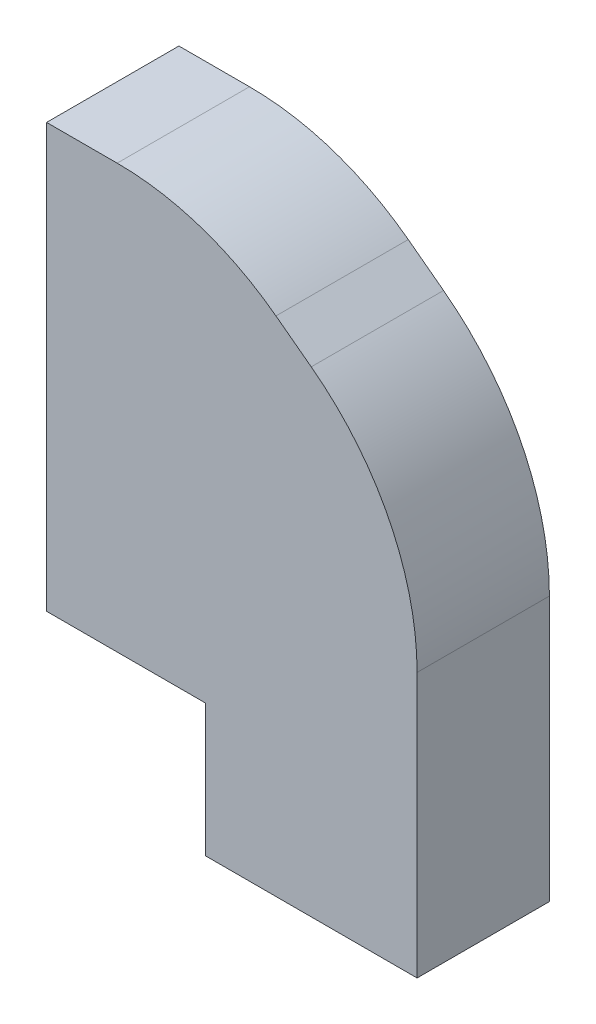
ISO-10303-21;
HEADER;
FILE_DESCRIPTION(('STEP AP214'),'2;1');
FILE_NAME('part.step','',(''),(''),'','','');
FILE_SCHEMA(('AUTOMOTIVE_DESIGN { 1 0 10303 214 1 1 1 1 }'));
ENDSEC;
DATA;
#1=APPLICATION_CONTEXT('core data for automotive mechanical design processes');
#2=APPLICATION_PROTOCOL_DEFINITION('international standard','automotive_design',2000,#1);
#3=PRODUCT_CONTEXT('',#1,'mechanical');
#4=PRODUCT('Part','Part','',(#3));
#5=PRODUCT_RELATED_PRODUCT_CATEGORY('part','',(#4));
#6=PRODUCT_DEFINITION_FORMATION('','',#4);
#7=PRODUCT_DEFINITION_CONTEXT('part definition',#1,'design');
#8=PRODUCT_DEFINITION('design','',#6,#7);
#9=PRODUCT_DEFINITION_SHAPE('','',#8);
#10=(LENGTH_UNIT() NAMED_UNIT(*) SI_UNIT(.MILLI.,.METRE.));
#11=(NAMED_UNIT(*) PLANE_ANGLE_UNIT() SI_UNIT($,.RADIAN.));
#12=(NAMED_UNIT(*) SI_UNIT($,.STERADIAN.) SOLID_ANGLE_UNIT());
#13=UNCERTAINTY_MEASURE_WITH_UNIT(LENGTH_MEASURE(1.E-05),#10,'distance_accuracy_value','');
#14=(GEOMETRIC_REPRESENTATION_CONTEXT(3) GLOBAL_UNCERTAINTY_ASSIGNED_CONTEXT((#13)) GLOBAL_UNIT_ASSIGNED_CONTEXT((#10,
#11,#12)) REPRESENTATION_CONTEXT('',''));
#15=CARTESIAN_POINT('',(0.,0.,0.));
#16=DIRECTION('',(0.,0.,1.));
#17=DIRECTION('',(1.,0.,0.));
#18=AXIS2_PLACEMENT_3D('',#15,#16,#17);
#19=CARTESIAN_POINT('',(0.,0.8,0.125));
#20=DIRECTION('',(1.,0.,0.));
#21=DIRECTION('',(0.,1.,0.));
#22=AXIS2_PLACEMENT_3D('',#19,#20,#21);
#23=PLANE('',#22);
#24=DIRECTION('',(0.,-1.,0.));
#25=VECTOR('',#24,1.);
#26=CARTESIAN_POINT('',(0.,0.8,-0.125));
#27=LINE('',#26,#25);
#28=CARTESIAN_POINT('',(0.,0.8,-0.125));
#29=VERTEX_POINT('',#28);
#30=CARTESIAN_POINT('',(0.,0.,-0.125));
#31=VERTEX_POINT('',#30);
#32=EDGE_CURVE('E158',#29,#31,#27,.T.);
#33=ORIENTED_EDGE('',*,*,#32,.T.);
#34=DIRECTION('',(0.,0.,-1.));
#35=VECTOR('',#34,1.);
#36=CARTESIAN_POINT('',(0.,0.,0.125));
#37=LINE('',#36,#35);
#38=CARTESIAN_POINT('',(0.,0.,0.125));
#39=VERTEX_POINT('',#38);
#40=EDGE_CURVE('E139',#39,#31,#37,.T.);
#41=ORIENTED_EDGE('',*,*,#40,.F.);
#42=DIRECTION('',(0.,-1.,0.));
#43=VECTOR('',#42,1.);
#44=CARTESIAN_POINT('',(0.,0.8,0.125));
#45=LINE('',#44,#43);
#46=CARTESIAN_POINT('',(0.,0.8,0.125));
#47=VERTEX_POINT('',#46);
#48=EDGE_CURVE('E146',#47,#39,#45,.T.);
#49=ORIENTED_EDGE('',*,*,#48,.F.);
#50=DIRECTION('',(0.,0.,-1.));
#51=VECTOR('',#50,1.);
#52=CARTESIAN_POINT('',(0.,0.8,0.125));
#53=LINE('',#52,#51);
#54=EDGE_CURVE('E224',#47,#29,#53,.T.);
#55=ORIENTED_EDGE('',*,*,#54,.T.);
#56=EDGE_LOOP('',(#33,#41,#49,#55));
#57=FACE_BOUND('',#56,.T.);
#58=ADVANCED_FACE('F42',(#57),#23,.F.);
#59=CARTESIAN_POINT('',(0.,0.,0.125));
#60=DIRECTION('',(0.,1.,0.));
#61=DIRECTION('',(0.,0.,1.));
#62=AXIS2_PLACEMENT_3D('',#59,#60,#61);
#63=PLANE('',#62);
#64=DIRECTION('',(1.,0.,0.));
#65=VECTOR('',#64,1.);
#66=CARTESIAN_POINT('',(0.,0.,-0.125));
#67=LINE('',#66,#65);
#68=CARTESIAN_POINT('',(0.3,0.,-0.125));
#69=VERTEX_POINT('',#68);
#70=EDGE_CURVE('E238',#31,#69,#67,.T.);
#71=ORIENTED_EDGE('',*,*,#70,.T.);
#72=DIRECTION('',(0.,0.,-1.));
#73=VECTOR('',#72,1.);
#74=CARTESIAN_POINT('',(0.3,0.,0.125));
#75=LINE('',#74,#73);
#76=CARTESIAN_POINT('',(0.3,0.,0.125));
#77=VERTEX_POINT('',#76);
#78=EDGE_CURVE('E142',#77,#69,#75,.T.);
#79=ORIENTED_EDGE('',*,*,#78,.F.);
#80=DIRECTION('',(1.,0.,0.));
#81=VECTOR('',#80,1.);
#82=CARTESIAN_POINT('',(0.,0.,0.125));
#83=LINE('',#82,#81);
#84=EDGE_CURVE('E135',#39,#77,#83,.T.);
#85=ORIENTED_EDGE('',*,*,#84,.F.);
#86=ORIENTED_EDGE('',*,*,#40,.T.);
#87=EDGE_LOOP('',(#71,#79,#85,#86));
#88=FACE_BOUND('',#87,.T.);
#89=ADVANCED_FACE('F137',(#88),#63,.F.);
#90=CARTESIAN_POINT('',(0.3,0.,0.125));
#91=DIRECTION('',(1.,0.,0.));
#92=DIRECTION('',(0.,1.,0.));
#93=AXIS2_PLACEMENT_3D('',#90,#91,#92);
#94=PLANE('',#93);
#95=DIRECTION('',(0.,-1.,0.));
#96=VECTOR('',#95,1.);
#97=CARTESIAN_POINT('',(0.3,0.,-0.125));
#98=LINE('',#97,#96);
#99=CARTESIAN_POINT('',(0.3,-0.25,-0.125));
#100=VERTEX_POINT('',#99);
#101=EDGE_CURVE('E218',#69,#100,#98,.T.);
#102=ORIENTED_EDGE('',*,*,#101,.T.);
#103=DIRECTION('',(0.,0.,-1.));
#104=VECTOR('',#103,1.);
#105=CARTESIAN_POINT('',(0.3,-0.25,0.125));
#106=LINE('',#105,#104);
#107=CARTESIAN_POINT('',(0.3,-0.25,0.125));
#108=VERTEX_POINT('',#107);
#109=EDGE_CURVE('E168',#108,#100,#106,.T.);
#110=ORIENTED_EDGE('',*,*,#109,.F.);
#111=DIRECTION('',(0.,-1.,0.));
#112=VECTOR('',#111,1.);
#113=CARTESIAN_POINT('',(0.3,0.,0.125));
#114=LINE('',#113,#112);
#115=EDGE_CURVE('E145',#77,#108,#114,.T.);
#116=ORIENTED_EDGE('',*,*,#115,.F.);
#117=ORIENTED_EDGE('',*,*,#78,.T.);
#118=EDGE_LOOP('',(#102,#110,#116,#117));
#119=FACE_BOUND('',#118,.T.);
#120=ADVANCED_FACE('F252',(#119),#94,.F.);
#121=CARTESIAN_POINT('',(0.3,-0.25,0.125));
#122=DIRECTION('',(0.,1.,0.));
#123=DIRECTION('',(0.,0.,1.));
#124=AXIS2_PLACEMENT_3D('',#121,#122,#123);
#125=PLANE('',#124);
#126=DIRECTION('',(1.,0.,0.));
#127=VECTOR('',#126,1.);
#128=CARTESIAN_POINT('',(0.3,-0.25,-0.125));
#129=LINE('',#128,#127);
#130=CARTESIAN_POINT('',(0.7,-0.25,-0.125));
#131=VERTEX_POINT('',#130);
#132=EDGE_CURVE('E212',#100,#131,#129,.T.);
#133=ORIENTED_EDGE('',*,*,#132,.T.);
#134=DIRECTION('',(0.,0.,-1.));
#135=VECTOR('',#134,1.);
#136=CARTESIAN_POINT('',(0.7,-0.25,0.125));
#137=LINE('',#136,#135);
#138=CARTESIAN_POINT('',(0.7,-0.25,0.125));
#139=VERTEX_POINT('',#138);
#140=EDGE_CURVE('E210',#139,#131,#137,.T.);
#141=ORIENTED_EDGE('',*,*,#140,.F.);
#142=DIRECTION('',(1.,0.,0.));
#143=VECTOR('',#142,1.);
#144=CARTESIAN_POINT('',(0.3,-0.25,0.125));
#145=LINE('',#144,#143);
#146=EDGE_CURVE('E235',#108,#139,#145,.T.);
#147=ORIENTED_EDGE('',*,*,#146,.F.);
#148=ORIENTED_EDGE('',*,*,#109,.T.);
#149=EDGE_LOOP('',(#133,#141,#147,#148));
#150=FACE_BOUND('',#149,.T.);
#151=ADVANCED_FACE('F234',(#150),#125,.F.);
#152=CARTESIAN_POINT('',(0.7,-0.128713314167698,0.125));
#153=DIRECTION('',(-1.,0.,0.));
#154=DIRECTION('',(0.,0.,1.));
#155=AXIS2_PLACEMENT_3D('',#152,#153,#154);
#156=PLANE('',#155);
#157=DIRECTION('',(0.,1.,0.));
#158=VECTOR('',#157,1.);
#159=CARTESIAN_POINT('',(0.7,-0.128713314167698,-0.125));
#160=LINE('',#159,#158);
#161=CARTESIAN_POINT('',(0.7,0.25,-0.125));
#162=VERTEX_POINT('',#161);
#163=EDGE_CURVE('E204',#131,#162,#160,.T.);
#164=ORIENTED_EDGE('',*,*,#163,.T.);
#165=DIRECTION('',(0.,0.,-1.));
#166=VECTOR('',#165,1.);
#167=CARTESIAN_POINT('',(0.7,0.25,0.125));
#168=LINE('',#167,#166);
#169=CARTESIAN_POINT('',(0.7,0.25,0.125));
#170=VERTEX_POINT('',#169);
#171=EDGE_CURVE('E72',#162,#170,#168,.F.);
#172=ORIENTED_EDGE('',*,*,#171,.T.);
#173=DIRECTION('',(0.,1.,0.));
#174=VECTOR('',#173,1.);
#175=CARTESIAN_POINT('',(0.7,-0.25,0.125));
#176=LINE('',#175,#174);
#177=EDGE_CURVE('E190',#139,#170,#176,.T.);
#178=ORIENTED_EDGE('',*,*,#177,.F.);
#179=ORIENTED_EDGE('',*,*,#140,.T.);
#180=EDGE_LOOP('',(#164,#172,#178,#179));
#181=FACE_BOUND('',#180,.T.);
#182=ADVANCED_FACE('F208',(#181),#156,.F.);
#183=CARTESIAN_POINT('',(0.3,0.8,0.125));
#184=DIRECTION('',(-0.6,-0.8,0.));
#185=DIRECTION('',(0.8,-0.6,0.));
#186=AXIS2_PLACEMENT_3D('',#183,#184,#185);
#187=PLANE('',#186);
#188=DIRECTION('',(-0.8,0.6,0.));
#189=VECTOR('',#188,1.);
#190=CARTESIAN_POINT('',(0.3,0.8,0.125));
#191=LINE('',#190,#189);
#192=CARTESIAN_POINT('',(0.5,0.65,0.125));
#193=VERTEX_POINT('',#192);
#194=CARTESIAN_POINT('',(0.433333333333333,0.7,0.125));
#195=VERTEX_POINT('',#194);
#196=EDGE_CURVE('E189',#193,#195,#191,.T.);
#197=ORIENTED_EDGE('',*,*,#196,.F.);
#198=DIRECTION('',(0.,0.,-1.));
#199=VECTOR('',#198,1.);
#200=CARTESIAN_POINT('',(0.5,0.65,0.125));
#201=LINE('',#200,#199);
#202=CARTESIAN_POINT('',(0.5,0.65,-0.125));
#203=VERTEX_POINT('',#202);
#204=EDGE_CURVE('E165',#193,#203,#201,.T.);
#205=ORIENTED_EDGE('',*,*,#204,.T.);
#206=DIRECTION('',(-0.8,0.6,0.));
#207=VECTOR('',#206,1.);
#208=CARTESIAN_POINT('',(0.3,0.8,-0.125));
#209=LINE('',#208,#207);
#210=CARTESIAN_POINT('',(0.433333333333333,0.7,-0.125));
#211=VERTEX_POINT('',#210);
#212=EDGE_CURVE('E206',#203,#211,#209,.T.);
#213=ORIENTED_EDGE('',*,*,#212,.T.);
#214=DIRECTION('',(0.,0.,-1.));
#215=VECTOR('',#214,1.);
#216=CARTESIAN_POINT('',(0.433333333333333,0.7,0.125));
#217=LINE('',#216,#215);
#218=EDGE_CURVE('E160',#211,#195,#217,.F.);
#219=ORIENTED_EDGE('',*,*,#218,.T.);
#220=EDGE_LOOP('',(#197,#205,#213,#219));
#221=FACE_BOUND('',#220,.T.);
#222=ADVANCED_FACE('F194',(#221),#187,.F.);
#223=CARTESIAN_POINT('',(0.,0.8,0.125));
#224=DIRECTION('',(0.,-1.,0.));
#225=DIRECTION('',(0.,0.,-1.));
#226=AXIS2_PLACEMENT_3D('',#223,#224,#225);
#227=PLANE('',#226);
#228=DIRECTION('',(-1.,0.,0.));
#229=VECTOR('',#228,1.);
#230=CARTESIAN_POINT('',(0.,0.8,0.125));
#231=LINE('',#230,#229);
#232=CARTESIAN_POINT('',(0.133333333333333,0.8,0.125));
#233=VERTEX_POINT('',#232);
#234=EDGE_CURVE('E150',#233,#47,#231,.T.);
#235=ORIENTED_EDGE('',*,*,#234,.F.);
#236=DIRECTION('',(0.,0.,-1.));
#237=VECTOR('',#236,1.);
#238=CARTESIAN_POINT('',(0.133333333333333,0.8,0.125));
#239=LINE('',#238,#237);
#240=CARTESIAN_POINT('',(0.133333333333333,0.8,-0.125));
#241=VERTEX_POINT('',#240);
#242=EDGE_CURVE('E11',#233,#241,#239,.T.);
#243=ORIENTED_EDGE('',*,*,#242,.T.);
#244=DIRECTION('',(-1.,0.,0.));
#245=VECTOR('',#244,1.);
#246=CARTESIAN_POINT('',(0.,0.8,-0.125));
#247=LINE('',#246,#245);
#248=EDGE_CURVE('E155',#241,#29,#247,.T.);
#249=ORIENTED_EDGE('',*,*,#248,.T.);
#250=ORIENTED_EDGE('',*,*,#54,.F.);
#251=EDGE_LOOP('',(#235,#243,#249,#250));
#252=FACE_BOUND('',#251,.T.);
#253=ADVANCED_FACE('F273',(#252),#227,.F.);
#254=CARTESIAN_POINT('',(0.,0.,0.125));
#255=DIRECTION('',(0.,0.,1.));
#256=DIRECTION('',(1.,0.,0.));
#257=AXIS2_PLACEMENT_3D('',#254,#255,#256);
#258=PLANE('',#257);
#259=ORIENTED_EDGE('',*,*,#177,.T.);
#260=CARTESIAN_POINT('',(0.2,0.25,0.125));
#261=DIRECTION('',(0.,0.,1.));
#262=DIRECTION('',(1.,0.,0.));
#263=AXIS2_PLACEMENT_3D('',#260,#261,#262);
#264=CIRCLE('',#263,0.5);
#265=EDGE_CURVE('E51',#170,#193,#264,.T.);
#266=ORIENTED_EDGE('',*,*,#265,.T.);
#267=ORIENTED_EDGE('',*,*,#196,.T.);
#268=CARTESIAN_POINT('',(0.133333333333333,0.3,0.125));
#269=DIRECTION('',(0.,0.,1.));
#270=DIRECTION('',(1.,0.,0.));
#271=AXIS2_PLACEMENT_3D('',#268,#269,#270);
#272=CIRCLE('',#271,0.5);
#273=EDGE_CURVE('E61',#195,#233,#272,.T.);
#274=ORIENTED_EDGE('',*,*,#273,.T.);
#275=ORIENTED_EDGE('',*,*,#234,.T.);
#276=ORIENTED_EDGE('',*,*,#48,.T.);
#277=ORIENTED_EDGE('',*,*,#84,.T.);
#278=ORIENTED_EDGE('',*,*,#115,.T.);
#279=ORIENTED_EDGE('',*,*,#146,.T.);
#280=EDGE_LOOP('',(#259,#266,#267,#274,#275,#276,#277,#278,#279));
#281=FACE_BOUND('',#280,.T.);
#282=ADVANCED_FACE('F149',(#281),#258,.T.);
#283=CARTESIAN_POINT('',(0.,0.,-0.125));
#284=DIRECTION('',(0.,0.,1.));
#285=DIRECTION('',(1.,0.,0.));
#286=AXIS2_PLACEMENT_3D('',#283,#284,#285);
#287=PLANE('',#286);
#288=ORIENTED_EDGE('',*,*,#212,.F.);
#289=CARTESIAN_POINT('',(0.2,0.25,-0.125));
#290=DIRECTION('',(0.,0.,1.));
#291=DIRECTION('',(1.,0.,0.));
#292=AXIS2_PLACEMENT_3D('',#289,#290,#291);
#293=CIRCLE('',#292,0.5);
#294=EDGE_CURVE('E178',#203,#162,#293,.F.);
#295=ORIENTED_EDGE('',*,*,#294,.T.);
#296=ORIENTED_EDGE('',*,*,#163,.F.);
#297=ORIENTED_EDGE('',*,*,#132,.F.);
#298=ORIENTED_EDGE('',*,*,#101,.F.);
#299=ORIENTED_EDGE('',*,*,#70,.F.);
#300=ORIENTED_EDGE('',*,*,#32,.F.);
#301=ORIENTED_EDGE('',*,*,#248,.F.);
#302=CARTESIAN_POINT('',(0.133333333333333,0.3,-0.125));
#303=DIRECTION('',(0.,0.,1.));
#304=DIRECTION('',(1.,0.,0.));
#305=AXIS2_PLACEMENT_3D('',#302,#303,#304);
#306=CIRCLE('',#305,0.5);
#307=EDGE_CURVE('E175',#241,#211,#306,.F.);
#308=ORIENTED_EDGE('',*,*,#307,.T.);
#309=EDGE_LOOP('',(#288,#295,#296,#297,#298,#299,#300,#301,#308));
#310=FACE_BOUND('',#309,.T.);
#311=ADVANCED_FACE('F202',(#310),#287,.F.);
#312=CARTESIAN_POINT('',(0.2,0.25,0.125));
#313=DIRECTION('',(0.,0.,-1.));
#314=DIRECTION('',(-1.,0.,0.));
#315=AXIS2_PLACEMENT_3D('',#312,#313,#314);
#316=CYLINDRICAL_SURFACE('',#315,0.5);
#317=ORIENTED_EDGE('',*,*,#265,.F.);
#318=ORIENTED_EDGE('',*,*,#171,.F.);
#319=ORIENTED_EDGE('',*,*,#294,.F.);
#320=ORIENTED_EDGE('',*,*,#204,.F.);
#321=EDGE_LOOP('',(#317,#318,#319,#320));
#322=FACE_BOUND('',#321,.T.);
#323=ADVANCED_FACE('F200',(#322),#316,.T.);
#324=CARTESIAN_POINT('',(0.133333333333333,0.3,0.125));
#325=DIRECTION('',(0.,0.,-1.));
#326=DIRECTION('',(-1.,0.,0.));
#327=AXIS2_PLACEMENT_3D('',#324,#325,#326);
#328=CYLINDRICAL_SURFACE('',#327,0.5);
#329=ORIENTED_EDGE('',*,*,#273,.F.);
#330=ORIENTED_EDGE('',*,*,#218,.F.);
#331=ORIENTED_EDGE('',*,*,#307,.F.);
#332=ORIENTED_EDGE('',*,*,#242,.F.);
#333=EDGE_LOOP('',(#329,#330,#331,#332));
#334=FACE_BOUND('',#333,.T.);
#335=ADVANCED_FACE('F44',(#334),#328,.T.);
#336=CLOSED_SHELL('',(#58,#89,#120,#151,#182,#222,#253,#282,#311,#323,#335));
#337=MANIFOLD_SOLID_BREP('B2',#336);
#338=ADVANCED_BREP_SHAPE_REPRESENTATION('',(#18,#337),#14);
#339=SHAPE_DEFINITION_REPRESENTATION(#9,#338);
ENDSEC;
END-ISO-10303-21;
